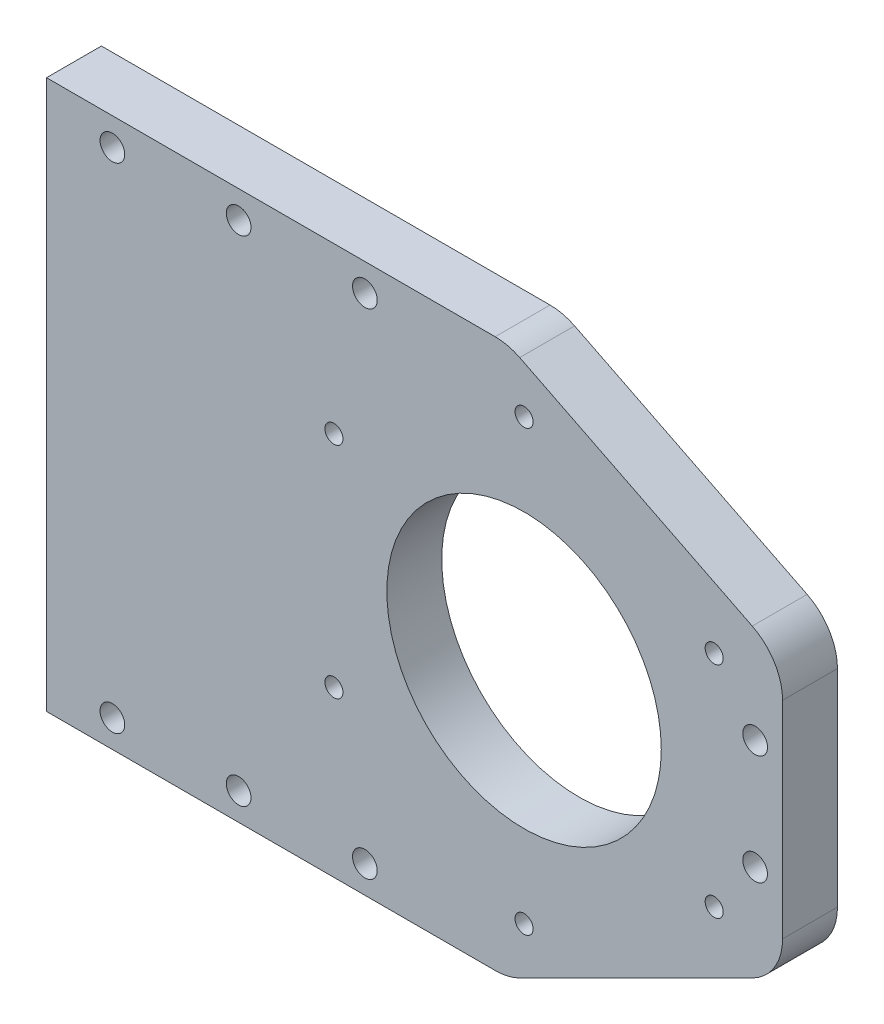
ISO-10303-21;
HEADER;
FILE_DESCRIPTION(('STEP AP214'),'2;1');
FILE_NAME('part.step','',(''),(''),'','','');
FILE_SCHEMA(('AUTOMOTIVE_DESIGN { 1 0 10303 214 1 1 1 1 }'));
ENDSEC;
DATA;
#1=APPLICATION_CONTEXT('core data for automotive mechanical design processes');
#2=APPLICATION_PROTOCOL_DEFINITION('international standard','automotive_design',2000,#1);
#3=PRODUCT_CONTEXT('',#1,'mechanical');
#4=PRODUCT('Part','Part','',(#3));
#5=PRODUCT_RELATED_PRODUCT_CATEGORY('part','',(#4));
#6=PRODUCT_DEFINITION_FORMATION('','',#4);
#7=PRODUCT_DEFINITION_CONTEXT('part definition',#1,'design');
#8=PRODUCT_DEFINITION('design','',#6,#7);
#9=PRODUCT_DEFINITION_SHAPE('','',#8);
#10=(LENGTH_UNIT() NAMED_UNIT(*) SI_UNIT(.MILLI.,.METRE.));
#11=(NAMED_UNIT(*) PLANE_ANGLE_UNIT() SI_UNIT($,.RADIAN.));
#12=(NAMED_UNIT(*) SI_UNIT($,.STERADIAN.) SOLID_ANGLE_UNIT());
#13=UNCERTAINTY_MEASURE_WITH_UNIT(LENGTH_MEASURE(1.E-05),#10,'distance_accuracy_value','');
#14=(GEOMETRIC_REPRESENTATION_CONTEXT(3) GLOBAL_UNCERTAINTY_ASSIGNED_CONTEXT((#13)) GLOBAL_UNIT_ASSIGNED_CONTEXT((#10,
#11,#12)) REPRESENTATION_CONTEXT('',''));
#15=CARTESIAN_POINT('',(0.,0.,0.));
#16=DIRECTION('',(0.,0.,1.));
#17=DIRECTION('',(1.,0.,0.));
#18=AXIS2_PLACEMENT_3D('',#15,#16,#17);
#19=CARTESIAN_POINT('',(0.,50.,10.));
#20=DIRECTION('',(0.,-1.,0.));
#21=DIRECTION('',(0.,0.,-1.));
#22=AXIS2_PLACEMENT_3D('',#19,#20,#21);
#23=PLANE('',#22);
#24=DIRECTION('',(-1.,0.,0.));
#25=VECTOR('',#24,1.);
#26=CARTESIAN_POINT('',(0.,50.,10.));
#27=LINE('',#26,#25);
#28=CARTESIAN_POINT('',(81.7393202250021,50.,10.));
#29=VERTEX_POINT('',#28);
#30=CARTESIAN_POINT('',(0.,50.,10.));
#31=VERTEX_POINT('',#30);
#32=EDGE_CURVE('E109',#29,#31,#27,.T.);
#33=ORIENTED_EDGE('',*,*,#32,.F.);
#34=DIRECTION('',(0.,0.,-1.));
#35=VECTOR('',#34,1.);
#36=CARTESIAN_POINT('',(81.7393202250021,50.,10.));
#37=LINE('',#36,#35);
#38=CARTESIAN_POINT('',(81.7393202250021,50.,0.));
#39=VERTEX_POINT('',#38);
#40=EDGE_CURVE('E11',#29,#39,#37,.T.);
#41=ORIENTED_EDGE('',*,*,#40,.T.);
#42=DIRECTION('',(-1.,0.,0.));
#43=VECTOR('',#42,1.);
#44=CARTESIAN_POINT('',(0.,50.,0.));
#45=LINE('',#44,#43);
#46=CARTESIAN_POINT('',(0.,50.,0.));
#47=VERTEX_POINT('',#46);
#48=EDGE_CURVE('E132',#39,#47,#45,.T.);
#49=ORIENTED_EDGE('',*,*,#48,.T.);
#50=DIRECTION('',(0.,0.,-1.));
#51=VECTOR('',#50,1.);
#52=CARTESIAN_POINT('',(0.,50.,10.));
#53=LINE('',#52,#51);
#54=EDGE_CURVE('E125',#31,#47,#53,.T.);
#55=ORIENTED_EDGE('',*,*,#54,.F.);
#56=EDGE_LOOP('',(#33,#41,#49,#55));
#57=FACE_BOUND('',#56,.T.);
#58=ADVANCED_FACE('F32',(#57),#23,.F.);
#59=CARTESIAN_POINT('',(0.,-50.,10.));
#60=DIRECTION('',(1.,0.,0.));
#61=DIRECTION('',(0.,0.,-1.));
#62=AXIS2_PLACEMENT_3D('',#59,#60,#61);
#63=PLANE('',#62);
#64=CARTESIAN_POINT('',(0.,-12.5,5.00000000000001));
#65=DIRECTION('',(-1.,0.,0.));
#66=DIRECTION('',(0.,0.,-1.));
#67=AXIS2_PLACEMENT_3D('',#64,#65,#66);
#68=CIRCLE('',#67,1.65);
#69=CARTESIAN_POINT('',(0.,-12.5,3.35000000000001));
#70=VERTEX_POINT('',#69);
#71=EDGE_CURVE('E219',#70,#70,#68,.T.);
#72=ORIENTED_EDGE('',*,*,#71,.F.);
#73=EDGE_LOOP('',(#72));
#74=FACE_BOUND('',#73,.T.);
#75=CARTESIAN_POINT('',(0.,-37.5,5.));
#76=DIRECTION('',(-1.,0.,0.));
#77=DIRECTION('',(0.,0.,-1.));
#78=AXIS2_PLACEMENT_3D('',#75,#76,#77);
#79=CIRCLE('',#78,1.65);
#80=CARTESIAN_POINT('',(0.,-37.5,3.35));
#81=VERTEX_POINT('',#80);
#82=EDGE_CURVE('E213',#81,#81,#79,.T.);
#83=ORIENTED_EDGE('',*,*,#82,.F.);
#84=EDGE_LOOP('',(#83));
#85=FACE_BOUND('',#84,.T.);
#86=CARTESIAN_POINT('',(0.,12.5,5.00000000000001));
#87=DIRECTION('',(-1.,0.,0.));
#88=DIRECTION('',(0.,0.,1.));
#89=AXIS2_PLACEMENT_3D('',#86,#87,#88);
#90=CIRCLE('',#89,1.65);
#91=CARTESIAN_POINT('',(0.,12.5,6.65));
#92=VERTEX_POINT('',#91);
#93=EDGE_CURVE('E207',#92,#92,#90,.T.);
#94=ORIENTED_EDGE('',*,*,#93,.F.);
#95=EDGE_LOOP('',(#94));
#96=FACE_BOUND('',#95,.T.);
#97=CARTESIAN_POINT('',(0.,37.5,5.));
#98=DIRECTION('',(-1.,0.,0.));
#99=DIRECTION('',(0.,0.,1.));
#100=AXIS2_PLACEMENT_3D('',#97,#98,#99);
#101=CIRCLE('',#100,1.65);
#102=CARTESIAN_POINT('',(0.,37.5,6.65));
#103=VERTEX_POINT('',#102);
#104=EDGE_CURVE('E201',#103,#103,#101,.T.);
#105=ORIENTED_EDGE('',*,*,#104,.F.);
#106=EDGE_LOOP('',(#105));
#107=FACE_BOUND('',#106,.T.);
#108=DIRECTION('',(0.,-1.,0.));
#109=VECTOR('',#108,1.);
#110=CARTESIAN_POINT('',(0.,-50.,0.));
#111=LINE('',#110,#109);
#112=CARTESIAN_POINT('',(0.,-50.,0.));
#113=VERTEX_POINT('',#112);
#114=EDGE_CURVE('E188',#47,#113,#111,.T.);
#115=ORIENTED_EDGE('',*,*,#114,.T.);
#116=DIRECTION('',(0.,0.,-1.));
#117=VECTOR('',#116,1.);
#118=CARTESIAN_POINT('',(0.,-50.,10.));
#119=LINE('',#118,#117);
#120=CARTESIAN_POINT('',(0.,-50.,10.));
#121=VERTEX_POINT('',#120);
#122=EDGE_CURVE('E127',#121,#113,#119,.T.);
#123=ORIENTED_EDGE('',*,*,#122,.F.);
#124=DIRECTION('',(0.,-1.,0.));
#125=VECTOR('',#124,1.);
#126=CARTESIAN_POINT('',(0.,-50.,10.));
#127=LINE('',#126,#125);
#128=EDGE_CURVE('E113',#31,#121,#127,.T.);
#129=ORIENTED_EDGE('',*,*,#128,.F.);
#130=ORIENTED_EDGE('',*,*,#54,.T.);
#131=EDGE_LOOP('',(#115,#123,#129,#130));
#132=FACE_BOUND('',#131,.T.);
#133=ADVANCED_FACE('F124',(#74,#85,#96,#107,#132),#63,.F.);
#134=CARTESIAN_POINT('',(0.,-50.,10.));
#135=DIRECTION('',(0.,1.,0.));
#136=DIRECTION('',(0.,0.,1.));
#137=AXIS2_PLACEMENT_3D('',#134,#135,#136);
#138=PLANE('',#137);
#139=DIRECTION('',(1.,0.,0.));
#140=VECTOR('',#139,1.);
#141=CARTESIAN_POINT('',(0.,-50.,0.));
#142=LINE('',#141,#140);
#143=CARTESIAN_POINT('',(81.7393202250021,-50.,0.));
#144=VERTEX_POINT('',#143);
#145=EDGE_CURVE('E185',#113,#144,#142,.T.);
#146=ORIENTED_EDGE('',*,*,#145,.T.);
#147=DIRECTION('',(0.,0.,-1.));
#148=VECTOR('',#147,1.);
#149=CARTESIAN_POINT('',(81.7393202250021,-50.,10.));
#150=LINE('',#149,#148);
#151=CARTESIAN_POINT('',(81.7393202250021,-50.,10.));
#152=VERTEX_POINT('',#151);
#153=EDGE_CURVE('E156',#144,#152,#150,.F.);
#154=ORIENTED_EDGE('',*,*,#153,.T.);
#155=DIRECTION('',(1.,0.,0.));
#156=VECTOR('',#155,1.);
#157=CARTESIAN_POINT('',(0.,-50.,10.));
#158=LINE('',#157,#156);
#159=EDGE_CURVE('E129',#121,#152,#158,.T.);
#160=ORIENTED_EDGE('',*,*,#159,.F.);
#161=ORIENTED_EDGE('',*,*,#122,.T.);
#162=EDGE_LOOP('',(#146,#154,#160,#161));
#163=FACE_BOUND('',#162,.T.);
#164=ADVANCED_FACE('F383',(#163),#138,.F.);
#165=CARTESIAN_POINT('',(84.1,-50.,10.));
#166=DIRECTION('',(-0.447213595499958,0.894427190999916,0.));
#167=DIRECTION('',(-0.894427190999916,-0.447213595499958,0.));
#168=AXIS2_PLACEMENT_3D('',#165,#166,#167);
#169=PLANE('',#168);
#170=DIRECTION('',(0.894427190999916,0.447213595499958,0.));
#171=VECTOR('',#170,1.);
#172=CARTESIAN_POINT('',(84.1,-50.,10.));
#173=LINE('',#172,#171);
#174=CARTESIAN_POINT('',(86.2114561800017,-48.9442719099992,10.));
#175=VERTEX_POINT('',#174);
#176=CARTESIAN_POINT('',(128.572135955,-27.7639320225002,10.));
#177=VERTEX_POINT('',#176);
#178=EDGE_CURVE('E194',#175,#177,#173,.T.);
#179=ORIENTED_EDGE('',*,*,#178,.F.);
#180=DIRECTION('',(0.,0.,-1.));
#181=VECTOR('',#180,1.);
#182=CARTESIAN_POINT('',(86.2114561800017,-48.9442719099992,10.));
#183=LINE('',#182,#181);
#184=CARTESIAN_POINT('',(86.2114561800017,-48.9442719099992,0.));
#185=VERTEX_POINT('',#184);
#186=EDGE_CURVE('E136',#175,#185,#183,.T.);
#187=ORIENTED_EDGE('',*,*,#186,.T.);
#188=DIRECTION('',(0.894427190999916,0.447213595499958,0.));
#189=VECTOR('',#188,1.);
#190=CARTESIAN_POINT('',(84.1,-50.,0.));
#191=LINE('',#190,#189);
#192=CARTESIAN_POINT('',(128.572135955,-27.7639320225002,0.));
#193=VERTEX_POINT('',#192);
#194=EDGE_CURVE('E180',#185,#193,#191,.T.);
#195=ORIENTED_EDGE('',*,*,#194,.T.);
#196=DIRECTION('',(0.,0.,-1.));
#197=VECTOR('',#196,1.);
#198=CARTESIAN_POINT('',(128.572135955,-27.7639320225002,10.));
#199=LINE('',#198,#197);
#200=EDGE_CURVE('E134',#193,#177,#199,.F.);
#201=ORIENTED_EDGE('',*,*,#200,.T.);
#202=EDGE_LOOP('',(#179,#187,#195,#201));
#203=FACE_BOUND('',#202,.T.);
#204=ADVANCED_FACE('F412',(#203),#169,.F.);
#205=CARTESIAN_POINT('',(134.1,-25.,10.));
#206=DIRECTION('',(-1.,0.,0.));
#207=DIRECTION('',(0.,0.,1.));
#208=AXIS2_PLACEMENT_3D('',#205,#206,#207);
#209=PLANE('',#208);
#210=DIRECTION('',(0.,1.,0.));
#211=VECTOR('',#210,1.);
#212=CARTESIAN_POINT('',(134.1,-25.,10.));
#213=LINE('',#212,#211);
#214=CARTESIAN_POINT('',(134.1,-18.819660112501,10.));
#215=VERTEX_POINT('',#214);
#216=CARTESIAN_POINT('',(134.1,18.819660112501,10.));
#217=VERTEX_POINT('',#216);
#218=EDGE_CURVE('E192',#215,#217,#213,.T.);
#219=ORIENTED_EDGE('',*,*,#218,.F.);
#220=DIRECTION('',(0.,0.,-1.));
#221=VECTOR('',#220,1.);
#222=CARTESIAN_POINT('',(134.1,-18.819660112501,10.));
#223=LINE('',#222,#221);
#224=CARTESIAN_POINT('',(134.1,-18.819660112501,0.));
#225=VERTEX_POINT('',#224);
#226=EDGE_CURVE('E166',#215,#225,#223,.T.);
#227=ORIENTED_EDGE('',*,*,#226,.T.);
#228=DIRECTION('',(0.,1.,0.));
#229=VECTOR('',#228,1.);
#230=CARTESIAN_POINT('',(134.1,-25.,0.));
#231=LINE('',#230,#229);
#232=CARTESIAN_POINT('',(134.1,18.819660112501,0.));
#233=VERTEX_POINT('',#232);
#234=EDGE_CURVE('E179',#225,#233,#231,.T.);
#235=ORIENTED_EDGE('',*,*,#234,.T.);
#236=DIRECTION('',(0.,0.,-1.));
#237=VECTOR('',#236,1.);
#238=CARTESIAN_POINT('',(134.1,18.819660112501,10.));
#239=LINE('',#238,#237);
#240=EDGE_CURVE('E164',#233,#217,#239,.F.);
#241=ORIENTED_EDGE('',*,*,#240,.T.);
#242=EDGE_LOOP('',(#219,#227,#235,#241));
#243=FACE_BOUND('',#242,.T.);
#244=ADVANCED_FACE('F406',(#243),#209,.F.);
#245=CARTESIAN_POINT('',(84.1,50.,10.));
#246=DIRECTION('',(-0.447213595499958,-0.894427190999916,0.));
#247=DIRECTION('',(0.894427190999916,-0.447213595499958,0.));
#248=AXIS2_PLACEMENT_3D('',#245,#246,#247);
#249=PLANE('',#248);
#250=DIRECTION('',(-0.894427190999916,0.447213595499958,0.));
#251=VECTOR('',#250,1.);
#252=CARTESIAN_POINT('',(84.1,50.,10.));
#253=LINE('',#252,#251);
#254=CARTESIAN_POINT('',(128.572135955,27.7639320225002,10.));
#255=VERTEX_POINT('',#254);
#256=CARTESIAN_POINT('',(86.2114561800017,48.9442719099992,10.));
#257=VERTEX_POINT('',#256);
#258=EDGE_CURVE('E138',#255,#257,#253,.T.);
#259=ORIENTED_EDGE('',*,*,#258,.F.);
#260=DIRECTION('',(0.,0.,-1.));
#261=VECTOR('',#260,1.);
#262=CARTESIAN_POINT('',(128.572135955,27.7639320225002,10.));
#263=LINE('',#262,#261);
#264=CARTESIAN_POINT('',(128.572135955,27.7639320225002,0.));
#265=VERTEX_POINT('',#264);
#266=EDGE_CURVE('E40',#255,#265,#263,.T.);
#267=ORIENTED_EDGE('',*,*,#266,.T.);
#268=DIRECTION('',(-0.894427190999916,0.447213595499958,0.));
#269=VECTOR('',#268,1.);
#270=CARTESIAN_POINT('',(84.1,50.,0.));
#271=LINE('',#270,#269);
#272=CARTESIAN_POINT('',(86.2114561800017,48.9442719099992,0.));
#273=VERTEX_POINT('',#272);
#274=EDGE_CURVE('E120',#265,#273,#271,.T.);
#275=ORIENTED_EDGE('',*,*,#274,.T.);
#276=DIRECTION('',(0.,0.,-1.));
#277=VECTOR('',#276,1.);
#278=CARTESIAN_POINT('',(86.2114561800017,48.9442719099992,10.));
#279=LINE('',#278,#277);
#280=EDGE_CURVE('E47',#273,#257,#279,.F.);
#281=ORIENTED_EDGE('',*,*,#280,.T.);
#282=EDGE_LOOP('',(#259,#267,#275,#281));
#283=FACE_BOUND('',#282,.T.);
#284=ADVANCED_FACE('F172',(#283),#249,.F.);
#285=CARTESIAN_POINT('',(134.1,50.,10.));
#286=DIRECTION('',(0.,0.,1.));
#287=DIRECTION('',(1.,0.,0.));
#288=AXIS2_PLACEMENT_3D('',#285,#286,#287);
#289=PLANE('',#288);
#290=CARTESIAN_POINT('',(129.1,-10.,10.));
#291=DIRECTION('',(0.,0.,-1.));
#292=DIRECTION('',(1.,0.,0.));
#293=AXIS2_PLACEMENT_3D('',#290,#291,#292);
#294=CIRCLE('',#293,2.25000000000001);
#295=CARTESIAN_POINT('',(131.35,-10.,10.));
#296=VERTEX_POINT('',#295);
#297=EDGE_CURVE('E317',#296,#296,#294,.T.);
#298=ORIENTED_EDGE('',*,*,#297,.T.);
#299=EDGE_LOOP('',(#298));
#300=FACE_BOUND('',#299,.T.);
#301=CARTESIAN_POINT('',(129.1,10.,10.));
#302=DIRECTION('',(0.,0.,-1.));
#303=DIRECTION('',(-1.,0.,0.));
#304=AXIS2_PLACEMENT_3D('',#301,#302,#303);
#305=CIRCLE('',#304,2.25000000000001);
#306=CARTESIAN_POINT('',(126.85,10.,10.));
#307=VERTEX_POINT('',#306);
#308=EDGE_CURVE('E312',#307,#307,#305,.T.);
#309=ORIENTED_EDGE('',*,*,#308,.T.);
#310=EDGE_LOOP('',(#309));
#311=FACE_BOUND('',#310,.T.);
#312=CARTESIAN_POINT('',(121.641016151378,20.,10.));
#313=DIRECTION('',(0.,0.,-1.));
#314=DIRECTION('',(-1.,0.,0.));
#315=AXIS2_PLACEMENT_3D('',#312,#313,#314);
#316=CIRCLE('',#315,1.65);
#317=CARTESIAN_POINT('',(119.991016151378,20.,10.));
#318=VERTEX_POINT('',#317);
#319=EDGE_CURVE('E306',#318,#318,#316,.T.);
#320=ORIENTED_EDGE('',*,*,#319,.T.);
#321=EDGE_LOOP('',(#320));
#322=FACE_BOUND('',#321,.T.);
#323=CARTESIAN_POINT('',(121.641016151378,-20.,10.));
#324=DIRECTION('',(0.,0.,-1.));
#325=DIRECTION('',(-1.,0.,0.));
#326=AXIS2_PLACEMENT_3D('',#323,#324,#325);
#327=CIRCLE('',#326,1.65);
#328=CARTESIAN_POINT('',(119.991016151378,-20.,10.));
#329=VERTEX_POINT('',#328);
#330=EDGE_CURVE('E300',#329,#329,#327,.T.);
#331=ORIENTED_EDGE('',*,*,#330,.T.);
#332=EDGE_LOOP('',(#331));
#333=FACE_BOUND('',#332,.T.);
#334=CARTESIAN_POINT('',(87.,-40.,10.));
#335=DIRECTION('',(0.,0.,-1.));
#336=DIRECTION('',(-1.,0.,0.));
#337=AXIS2_PLACEMENT_3D('',#334,#335,#336);
#338=CIRCLE('',#337,1.65);
#339=CARTESIAN_POINT('',(85.35,-40.,10.));
#340=VERTEX_POINT('',#339);
#341=EDGE_CURVE('E294',#340,#340,#338,.T.);
#342=ORIENTED_EDGE('',*,*,#341,.T.);
#343=EDGE_LOOP('',(#342));
#344=FACE_BOUND('',#343,.T.);
#345=CARTESIAN_POINT('',(52.3589838486224,-20.,10.));
#346=DIRECTION('',(0.,0.,-1.));
#347=DIRECTION('',(-1.,0.,0.));
#348=AXIS2_PLACEMENT_3D('',#345,#346,#347);
#349=CIRCLE('',#348,1.65);
#350=CARTESIAN_POINT('',(50.7089838486225,-20.,10.));
#351=VERTEX_POINT('',#350);
#352=EDGE_CURVE('E288',#351,#351,#349,.T.);
#353=ORIENTED_EDGE('',*,*,#352,.T.);
#354=EDGE_LOOP('',(#353));
#355=FACE_BOUND('',#354,.T.);
#356=CARTESIAN_POINT('',(52.3589838486224,20.,10.));
#357=DIRECTION('',(0.,0.,-1.));
#358=DIRECTION('',(-1.,0.,0.));
#359=AXIS2_PLACEMENT_3D('',#356,#357,#358);
#360=CIRCLE('',#359,1.65);
#361=CARTESIAN_POINT('',(50.7089838486224,20.,10.));
#362=VERTEX_POINT('',#361);
#363=EDGE_CURVE('E282',#362,#362,#360,.T.);
#364=ORIENTED_EDGE('',*,*,#363,.T.);
#365=EDGE_LOOP('',(#364));
#366=FACE_BOUND('',#365,.T.);
#367=CARTESIAN_POINT('',(87.,40.,10.));
#368=DIRECTION('',(0.,0.,-1.));
#369=DIRECTION('',(-1.,0.,0.));
#370=AXIS2_PLACEMENT_3D('',#367,#368,#369);
#371=CIRCLE('',#370,1.65);
#372=CARTESIAN_POINT('',(85.35,40.,10.));
#373=VERTEX_POINT('',#372);
#374=EDGE_CURVE('E278',#373,#373,#371,.T.);
#375=ORIENTED_EDGE('',*,*,#374,.T.);
#376=EDGE_LOOP('',(#375));
#377=FACE_BOUND('',#376,.T.);
#378=CARTESIAN_POINT('',(12.,45.,10.));
#379=DIRECTION('',(0.,0.,-1.));
#380=DIRECTION('',(-1.,0.,0.));
#381=AXIS2_PLACEMENT_3D('',#378,#379,#380);
#382=CIRCLE('',#381,2.25);
#383=CARTESIAN_POINT('',(9.75000000000001,45.,10.));
#384=VERTEX_POINT('',#383);
#385=EDGE_CURVE('E269',#384,#384,#382,.T.);
#386=ORIENTED_EDGE('',*,*,#385,.T.);
#387=EDGE_LOOP('',(#386));
#388=FACE_BOUND('',#387,.T.);
#389=CARTESIAN_POINT('',(35.,45.,10.));
#390=DIRECTION('',(0.,0.,-1.));
#391=DIRECTION('',(-1.,0.,0.));
#392=AXIS2_PLACEMENT_3D('',#389,#390,#391);
#393=CIRCLE('',#392,2.25);
#394=CARTESIAN_POINT('',(32.75,45.,10.));
#395=VERTEX_POINT('',#394);
#396=EDGE_CURVE('E260',#395,#395,#393,.T.);
#397=ORIENTED_EDGE('',*,*,#396,.T.);
#398=EDGE_LOOP('',(#397));
#399=FACE_BOUND('',#398,.T.);
#400=CARTESIAN_POINT('',(58.,45.,10.));
#401=DIRECTION('',(0.,0.,-1.));
#402=DIRECTION('',(-1.,0.,0.));
#403=AXIS2_PLACEMENT_3D('',#400,#401,#402);
#404=CIRCLE('',#403,2.25);
#405=CARTESIAN_POINT('',(55.75,45.,10.));
#406=VERTEX_POINT('',#405);
#407=EDGE_CURVE('E251',#406,#406,#404,.T.);
#408=ORIENTED_EDGE('',*,*,#407,.T.);
#409=EDGE_LOOP('',(#408));
#410=FACE_BOUND('',#409,.T.);
#411=CARTESIAN_POINT('',(12.,-45.,10.));
#412=DIRECTION('',(0.,0.,-1.));
#413=DIRECTION('',(-1.,0.,0.));
#414=AXIS2_PLACEMENT_3D('',#411,#412,#413);
#415=CIRCLE('',#414,2.25);
#416=CARTESIAN_POINT('',(9.74999999999996,-45.,10.));
#417=VERTEX_POINT('',#416);
#418=EDGE_CURVE('E242',#417,#417,#415,.T.);
#419=ORIENTED_EDGE('',*,*,#418,.T.);
#420=EDGE_LOOP('',(#419));
#421=FACE_BOUND('',#420,.T.);
#422=CARTESIAN_POINT('',(35.,-45.,10.));
#423=DIRECTION('',(0.,0.,-1.));
#424=DIRECTION('',(-1.,0.,0.));
#425=AXIS2_PLACEMENT_3D('',#422,#423,#424);
#426=CIRCLE('',#425,2.25);
#427=CARTESIAN_POINT('',(32.75,-45.,10.));
#428=VERTEX_POINT('',#427);
#429=EDGE_CURVE('E233',#428,#428,#426,.T.);
#430=ORIENTED_EDGE('',*,*,#429,.T.);
#431=EDGE_LOOP('',(#430));
#432=FACE_BOUND('',#431,.T.);
#433=CARTESIAN_POINT('',(58.,-45.,10.));
#434=DIRECTION('',(0.,0.,-1.));
#435=DIRECTION('',(-1.,0.,0.));
#436=AXIS2_PLACEMENT_3D('',#433,#434,#435);
#437=CIRCLE('',#436,2.25);
#438=CARTESIAN_POINT('',(55.75,-45.,10.));
#439=VERTEX_POINT('',#438);
#440=EDGE_CURVE('E222',#439,#439,#437,.T.);
#441=ORIENTED_EDGE('',*,*,#440,.T.);
#442=EDGE_LOOP('',(#441));
#443=FACE_BOUND('',#442,.T.);
#444=CARTESIAN_POINT('',(87.,0.,10.));
#445=DIRECTION('',(0.,0.,1.));
#446=DIRECTION('',(1.,0.,0.));
#447=AXIS2_PLACEMENT_3D('',#444,#445,#446);
#448=CIRCLE('',#447,25.);
#449=CARTESIAN_POINT('',(112.,0.,10.));
#450=VERTEX_POINT('',#449);
#451=EDGE_CURVE('E144',#450,#450,#448,.T.);
#452=ORIENTED_EDGE('',*,*,#451,.F.);
#453=EDGE_LOOP('',(#452));
#454=FACE_BOUND('',#453,.T.);
#455=ORIENTED_EDGE('',*,*,#159,.T.);
#456=CARTESIAN_POINT('',(81.7393202250021,-40.,10.));
#457=DIRECTION('',(0.,0.,1.));
#458=DIRECTION('',(1.,0.,0.));
#459=AXIS2_PLACEMENT_3D('',#456,#457,#458);
#460=CIRCLE('',#459,10.);
#461=EDGE_CURVE('E162',#152,#175,#460,.T.);
#462=ORIENTED_EDGE('',*,*,#461,.T.);
#463=ORIENTED_EDGE('',*,*,#178,.T.);
#464=CARTESIAN_POINT('',(124.1,-18.819660112501,10.));
#465=DIRECTION('',(0.,0.,1.));
#466=DIRECTION('',(1.,0.,0.));
#467=AXIS2_PLACEMENT_3D('',#464,#465,#466);
#468=CIRCLE('',#467,10.);
#469=EDGE_CURVE('E160',#177,#215,#468,.T.);
#470=ORIENTED_EDGE('',*,*,#469,.T.);
#471=ORIENTED_EDGE('',*,*,#218,.T.);
#472=CARTESIAN_POINT('',(124.1,18.819660112501,10.));
#473=DIRECTION('',(0.,0.,1.));
#474=DIRECTION('',(1.,0.,0.));
#475=AXIS2_PLACEMENT_3D('',#472,#473,#474);
#476=CIRCLE('',#475,10.);
#477=EDGE_CURVE('E54',#217,#255,#476,.T.);
#478=ORIENTED_EDGE('',*,*,#477,.T.);
#479=ORIENTED_EDGE('',*,*,#258,.T.);
#480=CARTESIAN_POINT('',(81.7393202250021,40.,10.));
#481=DIRECTION('',(0.,0.,1.));
#482=DIRECTION('',(1.,0.,0.));
#483=AXIS2_PLACEMENT_3D('',#480,#481,#482);
#484=CIRCLE('',#483,10.);
#485=EDGE_CURVE('E116',#257,#29,#484,.T.);
#486=ORIENTED_EDGE('',*,*,#485,.T.);
#487=ORIENTED_EDGE('',*,*,#32,.T.);
#488=ORIENTED_EDGE('',*,*,#128,.T.);
#489=EDGE_LOOP('',(#455,#462,#463,#470,#471,#478,#479,#486,#487,#488));
#490=FACE_BOUND('',#489,.T.);
#491=ADVANCED_FACE('F112',(#300,#311,#322,#333,#344,#355,#366,#377,#388,#399,#410,#421,#432,
#443,#454,#490),#289,.T.);
#492=CARTESIAN_POINT('',(134.1,50.,0.));
#493=DIRECTION('',(0.,0.,1.));
#494=DIRECTION('',(1.,0.,0.));
#495=AXIS2_PLACEMENT_3D('',#492,#493,#494);
#496=PLANE('',#495);
#497=CARTESIAN_POINT('',(129.1,10.,0.));
#498=DIRECTION('',(0.,0.,-1.));
#499=DIRECTION('',(-1.,0.,0.));
#500=AXIS2_PLACEMENT_3D('',#497,#498,#499);
#501=CIRCLE('',#500,4.70000000000001);
#502=CARTESIAN_POINT('',(124.4,10.,0.));
#503=VERTEX_POINT('',#502);
#504=EDGE_CURVE('E329',#503,#503,#501,.T.);
#505=ORIENTED_EDGE('',*,*,#504,.F.);
#506=EDGE_LOOP('',(#505));
#507=FACE_BOUND('',#506,.T.);
#508=CARTESIAN_POINT('',(129.1,-10.,0.));
#509=DIRECTION('',(0.,0.,-1.));
#510=DIRECTION('',(-1.,0.,0.));
#511=AXIS2_PLACEMENT_3D('',#508,#509,#510);
#512=CIRCLE('',#511,4.70000000000001);
#513=CARTESIAN_POINT('',(124.4,-10.,0.));
#514=VERTEX_POINT('',#513);
#515=EDGE_CURVE('E323',#514,#514,#512,.T.);
#516=ORIENTED_EDGE('',*,*,#515,.F.);
#517=EDGE_LOOP('',(#516));
#518=FACE_BOUND('',#517,.T.);
#519=CARTESIAN_POINT('',(121.641016151378,20.,0.));
#520=DIRECTION('',(0.,0.,-1.));
#521=DIRECTION('',(-1.,0.,0.));
#522=AXIS2_PLACEMENT_3D('',#519,#520,#521);
#523=CIRCLE('',#522,1.65);
#524=CARTESIAN_POINT('',(119.991016151378,20.,0.));
#525=VERTEX_POINT('',#524);
#526=EDGE_CURVE('E309',#525,#525,#523,.T.);
#527=ORIENTED_EDGE('',*,*,#526,.F.);
#528=EDGE_LOOP('',(#527));
#529=FACE_BOUND('',#528,.T.);
#530=CARTESIAN_POINT('',(121.641016151378,-20.,0.));
#531=DIRECTION('',(0.,0.,-1.));
#532=DIRECTION('',(-1.,0.,0.));
#533=AXIS2_PLACEMENT_3D('',#530,#531,#532);
#534=CIRCLE('',#533,1.65);
#535=CARTESIAN_POINT('',(119.991016151378,-20.,0.));
#536=VERTEX_POINT('',#535);
#537=EDGE_CURVE('E303',#536,#536,#534,.T.);
#538=ORIENTED_EDGE('',*,*,#537,.F.);
#539=EDGE_LOOP('',(#538));
#540=FACE_BOUND('',#539,.T.);
#541=CARTESIAN_POINT('',(87.,-40.,0.));
#542=DIRECTION('',(0.,0.,-1.));
#543=DIRECTION('',(-1.,0.,0.));
#544=AXIS2_PLACEMENT_3D('',#541,#542,#543);
#545=CIRCLE('',#544,1.65);
#546=CARTESIAN_POINT('',(85.35,-40.,0.));
#547=VERTEX_POINT('',#546);
#548=EDGE_CURVE('E297',#547,#547,#545,.T.);
#549=ORIENTED_EDGE('',*,*,#548,.F.);
#550=EDGE_LOOP('',(#549));
#551=FACE_BOUND('',#550,.T.);
#552=CARTESIAN_POINT('',(52.3589838486224,-20.,0.));
#553=DIRECTION('',(0.,0.,-1.));
#554=DIRECTION('',(-1.,0.,0.));
#555=AXIS2_PLACEMENT_3D('',#552,#553,#554);
#556=CIRCLE('',#555,1.65);
#557=CARTESIAN_POINT('',(50.7089838486225,-20.,0.));
#558=VERTEX_POINT('',#557);
#559=EDGE_CURVE('E291',#558,#558,#556,.T.);
#560=ORIENTED_EDGE('',*,*,#559,.F.);
#561=EDGE_LOOP('',(#560));
#562=FACE_BOUND('',#561,.T.);
#563=CARTESIAN_POINT('',(52.3589838486224,20.,0.));
#564=DIRECTION('',(0.,0.,-1.));
#565=DIRECTION('',(-1.,0.,0.));
#566=AXIS2_PLACEMENT_3D('',#563,#564,#565);
#567=CIRCLE('',#566,1.65);
#568=CARTESIAN_POINT('',(50.7089838486224,20.,0.));
#569=VERTEX_POINT('',#568);
#570=EDGE_CURVE('E285',#569,#569,#567,.T.);
#571=ORIENTED_EDGE('',*,*,#570,.F.);
#572=EDGE_LOOP('',(#571));
#573=FACE_BOUND('',#572,.T.);
#574=CARTESIAN_POINT('',(87.,40.,0.));
#575=DIRECTION('',(0.,0.,-1.));
#576=DIRECTION('',(-1.,0.,0.));
#577=AXIS2_PLACEMENT_3D('',#574,#575,#576);
#578=CIRCLE('',#577,1.65);
#579=CARTESIAN_POINT('',(85.35,40.,0.));
#580=VERTEX_POINT('',#579);
#581=EDGE_CURVE('E279',#580,#580,#578,.T.);
#582=ORIENTED_EDGE('',*,*,#581,.F.);
#583=EDGE_LOOP('',(#582));
#584=FACE_BOUND('',#583,.T.);
#585=CARTESIAN_POINT('',(12.,45.,0.));
#586=DIRECTION('',(0.,0.,-1.));
#587=DIRECTION('',(-1.,0.,0.));
#588=AXIS2_PLACEMENT_3D('',#585,#586,#587);
#589=CIRCLE('',#588,4.7);
#590=CARTESIAN_POINT('',(7.3,45.,0.));
#591=VERTEX_POINT('',#590);
#592=EDGE_CURVE('E275',#591,#591,#589,.T.);
#593=ORIENTED_EDGE('',*,*,#592,.F.);
#594=EDGE_LOOP('',(#593));
#595=FACE_BOUND('',#594,.T.);
#596=CARTESIAN_POINT('',(35.,45.,0.));
#597=DIRECTION('',(0.,0.,-1.));
#598=DIRECTION('',(-1.,0.,0.));
#599=AXIS2_PLACEMENT_3D('',#596,#597,#598);
#600=CIRCLE('',#599,4.7);
#601=CARTESIAN_POINT('',(30.3,45.,0.));
#602=VERTEX_POINT('',#601);
#603=EDGE_CURVE('E266',#602,#602,#600,.T.);
#604=ORIENTED_EDGE('',*,*,#603,.F.);
#605=EDGE_LOOP('',(#604));
#606=FACE_BOUND('',#605,.T.);
#607=CARTESIAN_POINT('',(58.,45.,0.));
#608=DIRECTION('',(0.,0.,-1.));
#609=DIRECTION('',(-1.,0.,0.));
#610=AXIS2_PLACEMENT_3D('',#607,#608,#609);
#611=CIRCLE('',#610,4.7);
#612=CARTESIAN_POINT('',(53.3,45.,0.));
#613=VERTEX_POINT('',#612);
#614=EDGE_CURVE('E257',#613,#613,#611,.T.);
#615=ORIENTED_EDGE('',*,*,#614,.F.);
#616=EDGE_LOOP('',(#615));
#617=FACE_BOUND('',#616,.T.);
#618=CARTESIAN_POINT('',(12.,-45.,0.));
#619=DIRECTION('',(0.,0.,-1.));
#620=DIRECTION('',(-1.,0.,0.));
#621=AXIS2_PLACEMENT_3D('',#618,#619,#620);
#622=CIRCLE('',#621,4.7);
#623=CARTESIAN_POINT('',(7.29999999999996,-45.,0.));
#624=VERTEX_POINT('',#623);
#625=EDGE_CURVE('E248',#624,#624,#622,.T.);
#626=ORIENTED_EDGE('',*,*,#625,.F.);
#627=EDGE_LOOP('',(#626));
#628=FACE_BOUND('',#627,.T.);
#629=CARTESIAN_POINT('',(35.,-45.,0.));
#630=DIRECTION('',(0.,0.,-1.));
#631=DIRECTION('',(-1.,0.,0.));
#632=AXIS2_PLACEMENT_3D('',#629,#630,#631);
#633=CIRCLE('',#632,4.7);
#634=CARTESIAN_POINT('',(30.3,-45.,0.));
#635=VERTEX_POINT('',#634);
#636=EDGE_CURVE('E239',#635,#635,#633,.T.);
#637=ORIENTED_EDGE('',*,*,#636,.F.);
#638=EDGE_LOOP('',(#637));
#639=FACE_BOUND('',#638,.T.);
#640=CARTESIAN_POINT('',(58.,-45.,0.));
#641=DIRECTION('',(0.,0.,-1.));
#642=DIRECTION('',(-1.,0.,0.));
#643=AXIS2_PLACEMENT_3D('',#640,#641,#642);
#644=CIRCLE('',#643,4.7);
#645=CARTESIAN_POINT('',(53.3,-45.,0.));
#646=VERTEX_POINT('',#645);
#647=EDGE_CURVE('E230',#646,#646,#644,.T.);
#648=ORIENTED_EDGE('',*,*,#647,.F.);
#649=EDGE_LOOP('',(#648));
#650=FACE_BOUND('',#649,.T.);
#651=CARTESIAN_POINT('',(87.,0.,0.));
#652=DIRECTION('',(0.,0.,1.));
#653=DIRECTION('',(1.,0.,0.));
#654=AXIS2_PLACEMENT_3D('',#651,#652,#653);
#655=CIRCLE('',#654,25.);
#656=CARTESIAN_POINT('',(112.,0.,0.));
#657=VERTEX_POINT('',#656);
#658=EDGE_CURVE('E142',#657,#657,#655,.T.);
#659=ORIENTED_EDGE('',*,*,#658,.T.);
#660=EDGE_LOOP('',(#659));
#661=FACE_BOUND('',#660,.T.);
#662=ORIENTED_EDGE('',*,*,#194,.F.);
#663=CARTESIAN_POINT('',(81.7393202250021,-40.,0.));
#664=DIRECTION('',(0.,0.,1.));
#665=DIRECTION('',(1.,0.,0.));
#666=AXIS2_PLACEMENT_3D('',#663,#664,#665);
#667=CIRCLE('',#666,10.);
#668=EDGE_CURVE('E154',#185,#144,#667,.F.);
#669=ORIENTED_EDGE('',*,*,#668,.T.);
#670=ORIENTED_EDGE('',*,*,#145,.F.);
#671=ORIENTED_EDGE('',*,*,#114,.F.);
#672=ORIENTED_EDGE('',*,*,#48,.F.);
#673=CARTESIAN_POINT('',(81.7393202250021,40.,0.));
#674=DIRECTION('',(0.,0.,1.));
#675=DIRECTION('',(1.,0.,0.));
#676=AXIS2_PLACEMENT_3D('',#673,#674,#675);
#677=CIRCLE('',#676,10.);
#678=EDGE_CURVE('E148',#39,#273,#677,.F.);
#679=ORIENTED_EDGE('',*,*,#678,.T.);
#680=ORIENTED_EDGE('',*,*,#274,.F.);
#681=CARTESIAN_POINT('',(124.1,18.819660112501,0.));
#682=DIRECTION('',(0.,0.,1.));
#683=DIRECTION('',(1.,0.,0.));
#684=AXIS2_PLACEMENT_3D('',#681,#682,#683);
#685=CIRCLE('',#684,10.);
#686=EDGE_CURVE('E150',#265,#233,#685,.F.);
#687=ORIENTED_EDGE('',*,*,#686,.T.);
#688=ORIENTED_EDGE('',*,*,#234,.F.);
#689=CARTESIAN_POINT('',(124.1,-18.819660112501,0.));
#690=DIRECTION('',(0.,0.,1.));
#691=DIRECTION('',(1.,0.,0.));
#692=AXIS2_PLACEMENT_3D('',#689,#690,#691);
#693=CIRCLE('',#692,10.);
#694=EDGE_CURVE('E152',#225,#193,#693,.F.);
#695=ORIENTED_EDGE('',*,*,#694,.T.);
#696=EDGE_LOOP('',(#662,#669,#670,#671,#672,#679,#680,#687,#688,#695));
#697=FACE_BOUND('',#696,.T.);
#698=ADVANCED_FACE('F176',(#507,#518,#529,#540,#551,#562,#573,#584,#595,#606,#617,#628,#639,
#650,#661,#697),#496,.F.);
#699=CARTESIAN_POINT('',(87.,0.,-10.));
#700=DIRECTION('',(0.,0.,1.));
#701=DIRECTION('',(1.,0.,0.));
#702=AXIS2_PLACEMENT_3D('',#699,#700,#701);
#703=CYLINDRICAL_SURFACE('',#702,25.);
#704=ORIENTED_EDGE('',*,*,#451,.T.);
#705=EDGE_LOOP('',(#704));
#706=FACE_BOUND('',#705,.T.);
#707=ORIENTED_EDGE('',*,*,#658,.F.);
#708=EDGE_LOOP('',(#707));
#709=FACE_BOUND('',#708,.T.);
#710=ADVANCED_FACE('F337',(#706,#709),#703,.F.);
#711=CARTESIAN_POINT('',(15.,37.5,5.));
#712=DIRECTION('',(-1.,0.,0.));
#713=DIRECTION('',(0.,0.,1.));
#714=AXIS2_PLACEMENT_3D('',#711,#712,#713);
#715=CYLINDRICAL_SURFACE('',#714,1.65);
#716=CARTESIAN_POINT('',(15.,37.5,5.));
#717=DIRECTION('',(-1.,0.,0.));
#718=DIRECTION('',(0.,0.,1.));
#719=AXIS2_PLACEMENT_3D('',#716,#717,#718);
#720=CIRCLE('',#719,1.65);
#721=CARTESIAN_POINT('',(15.,37.5,6.65));
#722=VERTEX_POINT('',#721);
#723=EDGE_CURVE('E200',#722,#722,#720,.T.);
#724=ORIENTED_EDGE('',*,*,#723,.F.);
#725=EDGE_LOOP('',(#724));
#726=FACE_BOUND('',#725,.T.);
#727=ORIENTED_EDGE('',*,*,#104,.T.);
#728=EDGE_LOOP('',(#727));
#729=FACE_BOUND('',#728,.T.);
#730=ADVANCED_FACE('F368',(#726,#729),#715,.F.);
#731=CARTESIAN_POINT('',(15.,37.5,5.));
#732=DIRECTION('',(-1.,0.,0.));
#733=DIRECTION('',(0.,0.,1.));
#734=AXIS2_PLACEMENT_3D('',#731,#732,#733);
#735=PLANE('',#734);
#736=ORIENTED_EDGE('',*,*,#723,.T.);
#737=EDGE_LOOP('',(#736));
#738=FACE_BOUND('',#737,.T.);
#739=ADVANCED_FACE('F374',(#738),#735,.T.);
#740=CARTESIAN_POINT('',(15.,12.5,5.00000000000001));
#741=DIRECTION('',(-1.,0.,0.));
#742=DIRECTION('',(0.,0.,1.));
#743=AXIS2_PLACEMENT_3D('',#740,#741,#742);
#744=CYLINDRICAL_SURFACE('',#743,1.65);
#745=CARTESIAN_POINT('',(15.,12.5,5.00000000000001));
#746=DIRECTION('',(-1.,0.,0.));
#747=DIRECTION('',(0.,0.,1.));
#748=AXIS2_PLACEMENT_3D('',#745,#746,#747);
#749=CIRCLE('',#748,1.65);
#750=CARTESIAN_POINT('',(15.,12.5,6.65));
#751=VERTEX_POINT('',#750);
#752=EDGE_CURVE('E204',#751,#751,#749,.T.);
#753=ORIENTED_EDGE('',*,*,#752,.F.);
#754=EDGE_LOOP('',(#753));
#755=FACE_BOUND('',#754,.T.);
#756=ORIENTED_EDGE('',*,*,#93,.T.);
#757=EDGE_LOOP('',(#756));
#758=FACE_BOUND('',#757,.T.);
#759=ADVANCED_FACE('F499',(#755,#758),#744,.F.);
#760=CARTESIAN_POINT('',(15.,12.5,5.00000000000001));
#761=DIRECTION('',(-1.,0.,0.));
#762=DIRECTION('',(0.,0.,1.));
#763=AXIS2_PLACEMENT_3D('',#760,#761,#762);
#764=PLANE('',#763);
#765=ORIENTED_EDGE('',*,*,#752,.T.);
#766=EDGE_LOOP('',(#765));
#767=FACE_BOUND('',#766,.T.);
#768=ADVANCED_FACE('F495',(#767),#764,.T.);
#769=CARTESIAN_POINT('',(15.,-37.5,5.));
#770=DIRECTION('',(-1.,0.,0.));
#771=DIRECTION('',(0.,0.,1.));
#772=AXIS2_PLACEMENT_3D('',#769,#770,#771);
#773=CYLINDRICAL_SURFACE('',#772,1.65);
#774=CARTESIAN_POINT('',(15.,-37.5,5.));
#775=DIRECTION('',(-1.,0.,0.));
#776=DIRECTION('',(0.,0.,-1.));
#777=AXIS2_PLACEMENT_3D('',#774,#775,#776);
#778=CIRCLE('',#777,1.65);
#779=CARTESIAN_POINT('',(15.,-37.5,3.35));
#780=VERTEX_POINT('',#779);
#781=EDGE_CURVE('E210',#780,#780,#778,.T.);
#782=ORIENTED_EDGE('',*,*,#781,.F.);
#783=EDGE_LOOP('',(#782));
#784=FACE_BOUND('',#783,.T.);
#785=ORIENTED_EDGE('',*,*,#82,.T.);
#786=EDGE_LOOP('',(#785));
#787=FACE_BOUND('',#786,.T.);
#788=ADVANCED_FACE('F491',(#784,#787),#773,.F.);
#789=CARTESIAN_POINT('',(15.,-37.5,5.));
#790=DIRECTION('',(1.,0.,0.));
#791=DIRECTION('',(0.,0.,-1.));
#792=AXIS2_PLACEMENT_3D('',#789,#790,#791);
#793=PLANE('',#792);
#794=ORIENTED_EDGE('',*,*,#781,.T.);
#795=EDGE_LOOP('',(#794));
#796=FACE_BOUND('',#795,.T.);
#797=ADVANCED_FACE('F487',(#796),#793,.F.);
#798=CARTESIAN_POINT('',(15.,-12.5,5.00000000000001));
#799=DIRECTION('',(-1.,0.,0.));
#800=DIRECTION('',(0.,0.,1.));
#801=AXIS2_PLACEMENT_3D('',#798,#799,#800);
#802=CYLINDRICAL_SURFACE('',#801,1.65);
#803=CARTESIAN_POINT('',(15.,-12.5,5.00000000000001));
#804=DIRECTION('',(-1.,0.,0.));
#805=DIRECTION('',(0.,0.,-1.));
#806=AXIS2_PLACEMENT_3D('',#803,#804,#805);
#807=CIRCLE('',#806,1.65);
#808=CARTESIAN_POINT('',(15.,-12.5,3.35000000000001));
#809=VERTEX_POINT('',#808);
#810=EDGE_CURVE('E216',#809,#809,#807,.T.);
#811=ORIENTED_EDGE('',*,*,#810,.F.);
#812=EDGE_LOOP('',(#811));
#813=FACE_BOUND('',#812,.T.);
#814=ORIENTED_EDGE('',*,*,#71,.T.);
#815=EDGE_LOOP('',(#814));
#816=FACE_BOUND('',#815,.T.);
#817=ADVANCED_FACE('F483',(#813,#816),#802,.F.);
#818=CARTESIAN_POINT('',(15.,-12.5,5.00000000000001));
#819=DIRECTION('',(1.,0.,0.));
#820=DIRECTION('',(0.,0.,-1.));
#821=AXIS2_PLACEMENT_3D('',#818,#819,#820);
#822=PLANE('',#821);
#823=ORIENTED_EDGE('',*,*,#810,.T.);
#824=EDGE_LOOP('',(#823));
#825=FACE_BOUND('',#824,.T.);
#826=ADVANCED_FACE('F465',(#825),#822,.F.);
#827=CARTESIAN_POINT('',(58.,-45.,0.));
#828=DIRECTION('',(0.,0.,-1.));
#829=DIRECTION('',(-1.,0.,0.));
#830=AXIS2_PLACEMENT_3D('',#827,#828,#829);
#831=CYLINDRICAL_SURFACE('',#830,2.25);
#832=ORIENTED_EDGE('',*,*,#440,.F.);
#833=EDGE_LOOP('',(#832));
#834=FACE_BOUND('',#833,.T.);
#835=CARTESIAN_POINT('',(58.,-45.,2.45));
#836=DIRECTION('',(0.,0.,-1.));
#837=DIRECTION('',(-1.,0.,0.));
#838=AXIS2_PLACEMENT_3D('',#835,#836,#837);
#839=CIRCLE('',#838,2.25);
#840=CARTESIAN_POINT('',(55.75,-45.,2.45));
#841=VERTEX_POINT('',#840);
#842=EDGE_CURVE('E227',#841,#841,#839,.T.);
#843=ORIENTED_EDGE('',*,*,#842,.T.);
#844=EDGE_LOOP('',(#843));
#845=FACE_BOUND('',#844,.T.);
#846=ADVANCED_FACE('F461',(#834,#845),#831,.F.);
#847=CARTESIAN_POINT('',(58.,-45.,0.));
#848=DIRECTION('',(0.,0.,-1.));
#849=DIRECTION('',(-1.,0.,0.));
#850=AXIS2_PLACEMENT_3D('',#847,#848,#849);
#851=CONICAL_SURFACE('',#850,4.7,0.78539816339745);
#852=ORIENTED_EDGE('',*,*,#842,.F.);
#853=EDGE_LOOP('',(#852));
#854=FACE_BOUND('',#853,.T.);
#855=ORIENTED_EDGE('',*,*,#647,.T.);
#856=EDGE_LOOP('',(#855));
#857=FACE_BOUND('',#856,.T.);
#858=ADVANCED_FACE('F464',(#854,#857),#851,.F.);
#859=CARTESIAN_POINT('',(35.,-45.,0.));
#860=DIRECTION('',(0.,0.,-1.));
#861=DIRECTION('',(-1.,0.,0.));
#862=AXIS2_PLACEMENT_3D('',#859,#860,#861);
#863=CYLINDRICAL_SURFACE('',#862,2.25);
#864=ORIENTED_EDGE('',*,*,#429,.F.);
#865=EDGE_LOOP('',(#864));
#866=FACE_BOUND('',#865,.T.);
#867=CARTESIAN_POINT('',(35.,-45.,2.45));
#868=DIRECTION('',(0.,0.,-1.));
#869=DIRECTION('',(-1.,0.,0.));
#870=AXIS2_PLACEMENT_3D('',#867,#868,#869);
#871=CIRCLE('',#870,2.25);
#872=CARTESIAN_POINT('',(32.75,-45.,2.45));
#873=VERTEX_POINT('',#872);
#874=EDGE_CURVE('E236',#873,#873,#871,.T.);
#875=ORIENTED_EDGE('',*,*,#874,.T.);
#876=EDGE_LOOP('',(#875));
#877=FACE_BOUND('',#876,.T.);
#878=ADVANCED_FACE('F471',(#866,#877),#863,.F.);
#879=CARTESIAN_POINT('',(35.,-45.,0.));
#880=DIRECTION('',(0.,0.,-1.));
#881=DIRECTION('',(-1.,0.,0.));
#882=AXIS2_PLACEMENT_3D('',#879,#880,#881);
#883=CONICAL_SURFACE('',#882,4.7,0.785398163397448);
#884=ORIENTED_EDGE('',*,*,#874,.F.);
#885=EDGE_LOOP('',(#884));
#886=FACE_BOUND('',#885,.T.);
#887=ORIENTED_EDGE('',*,*,#636,.T.);
#888=EDGE_LOOP('',(#887));
#889=FACE_BOUND('',#888,.T.);
#890=ADVANCED_FACE('F476',(#886,#889),#883,.F.);
#891=CARTESIAN_POINT('',(12.,-45.,0.));
#892=DIRECTION('',(0.,0.,-1.));
#893=DIRECTION('',(-1.,0.,0.));
#894=AXIS2_PLACEMENT_3D('',#891,#892,#893);
#895=CYLINDRICAL_SURFACE('',#894,2.25);
#896=ORIENTED_EDGE('',*,*,#418,.F.);
#897=EDGE_LOOP('',(#896));
#898=FACE_BOUND('',#897,.T.);
#899=CARTESIAN_POINT('',(12.,-45.,2.45));
#900=DIRECTION('',(0.,0.,-1.));
#901=DIRECTION('',(-1.,0.,0.));
#902=AXIS2_PLACEMENT_3D('',#899,#900,#901);
#903=CIRCLE('',#902,2.25);
#904=CARTESIAN_POINT('',(9.74999999999996,-45.,2.45));
#905=VERTEX_POINT('',#904);
#906=EDGE_CURVE('E245',#905,#905,#903,.T.);
#907=ORIENTED_EDGE('',*,*,#906,.T.);
#908=EDGE_LOOP('',(#907));
#909=FACE_BOUND('',#908,.T.);
#910=ADVANCED_FACE('F561',(#898,#909),#895,.F.);
#911=CARTESIAN_POINT('',(12.,-45.,0.));
#912=DIRECTION('',(0.,0.,-1.));
#913=DIRECTION('',(-1.,0.,0.));
#914=AXIS2_PLACEMENT_3D('',#911,#912,#913);
#915=CONICAL_SURFACE('',#914,4.7,0.785398163397448);
#916=ORIENTED_EDGE('',*,*,#906,.F.);
#917=EDGE_LOOP('',(#916));
#918=FACE_BOUND('',#917,.T.);
#919=ORIENTED_EDGE('',*,*,#625,.T.);
#920=EDGE_LOOP('',(#919));
#921=FACE_BOUND('',#920,.T.);
#922=ADVANCED_FACE('F570',(#918,#921),#915,.F.);
#923=CARTESIAN_POINT('',(58.,45.,0.));
#924=DIRECTION('',(0.,0.,-1.));
#925=DIRECTION('',(-1.,0.,0.));
#926=AXIS2_PLACEMENT_3D('',#923,#924,#925);
#927=CYLINDRICAL_SURFACE('',#926,2.25);
#928=ORIENTED_EDGE('',*,*,#407,.F.);
#929=EDGE_LOOP('',(#928));
#930=FACE_BOUND('',#929,.T.);
#931=CARTESIAN_POINT('',(58.,45.,2.45));
#932=DIRECTION('',(0.,0.,-1.));
#933=DIRECTION('',(-1.,0.,0.));
#934=AXIS2_PLACEMENT_3D('',#931,#932,#933);
#935=CIRCLE('',#934,2.25);
#936=CARTESIAN_POINT('',(55.75,45.,2.45));
#937=VERTEX_POINT('',#936);
#938=EDGE_CURVE('E254',#937,#937,#935,.T.);
#939=ORIENTED_EDGE('',*,*,#938,.T.);
#940=EDGE_LOOP('',(#939));
#941=FACE_BOUND('',#940,.T.);
#942=ADVANCED_FACE('F580',(#930,#941),#927,.F.);
#943=CARTESIAN_POINT('',(58.,45.,0.));
#944=DIRECTION('',(0.,0.,-1.));
#945=DIRECTION('',(-1.,0.,0.));
#946=AXIS2_PLACEMENT_3D('',#943,#944,#945);
#947=CONICAL_SURFACE('',#946,4.7,0.78539816339745);
#948=ORIENTED_EDGE('',*,*,#938,.F.);
#949=EDGE_LOOP('',(#948));
#950=FACE_BOUND('',#949,.T.);
#951=ORIENTED_EDGE('',*,*,#614,.T.);
#952=EDGE_LOOP('',(#951));
#953=FACE_BOUND('',#952,.T.);
#954=ADVANCED_FACE('F590',(#950,#953),#947,.F.);
#955=CARTESIAN_POINT('',(35.,45.,0.));
#956=DIRECTION('',(0.,0.,-1.));
#957=DIRECTION('',(-1.,0.,0.));
#958=AXIS2_PLACEMENT_3D('',#955,#956,#957);
#959=CYLINDRICAL_SURFACE('',#958,2.25);
#960=ORIENTED_EDGE('',*,*,#396,.F.);
#961=EDGE_LOOP('',(#960));
#962=FACE_BOUND('',#961,.T.);
#963=CARTESIAN_POINT('',(35.,45.,2.45));
#964=DIRECTION('',(0.,0.,-1.));
#965=DIRECTION('',(-1.,0.,0.));
#966=AXIS2_PLACEMENT_3D('',#963,#964,#965);
#967=CIRCLE('',#966,2.25);
#968=CARTESIAN_POINT('',(32.75,45.,2.45));
#969=VERTEX_POINT('',#968);
#970=EDGE_CURVE('E263',#969,#969,#967,.T.);
#971=ORIENTED_EDGE('',*,*,#970,.T.);
#972=EDGE_LOOP('',(#971));
#973=FACE_BOUND('',#972,.T.);
#974=ADVANCED_FACE('F600',(#962,#973),#959,.F.);
#975=CARTESIAN_POINT('',(35.,45.,0.));
#976=DIRECTION('',(0.,0.,-1.));
#977=DIRECTION('',(-1.,0.,0.));
#978=AXIS2_PLACEMENT_3D('',#975,#976,#977);
#979=CONICAL_SURFACE('',#978,4.7,0.785398163397448);
#980=ORIENTED_EDGE('',*,*,#970,.F.);
#981=EDGE_LOOP('',(#980));
#982=FACE_BOUND('',#981,.T.);
#983=ORIENTED_EDGE('',*,*,#603,.T.);
#984=EDGE_LOOP('',(#983));
#985=FACE_BOUND('',#984,.T.);
#986=ADVANCED_FACE('F610',(#982,#985),#979,.F.);
#987=CARTESIAN_POINT('',(12.,45.,0.));
#988=DIRECTION('',(0.,0.,-1.));
#989=DIRECTION('',(-1.,0.,0.));
#990=AXIS2_PLACEMENT_3D('',#987,#988,#989);
#991=CYLINDRICAL_SURFACE('',#990,2.25);
#992=ORIENTED_EDGE('',*,*,#385,.F.);
#993=EDGE_LOOP('',(#992));
#994=FACE_BOUND('',#993,.T.);
#995=CARTESIAN_POINT('',(12.,45.,2.45));
#996=DIRECTION('',(0.,0.,-1.));
#997=DIRECTION('',(-1.,0.,0.));
#998=AXIS2_PLACEMENT_3D('',#995,#996,#997);
#999=CIRCLE('',#998,2.25);
#1000=CARTESIAN_POINT('',(9.75,45.,2.45));
#1001=VERTEX_POINT('',#1000);
#1002=EDGE_CURVE('E272',#1001,#1001,#999,.T.);
#1003=ORIENTED_EDGE('',*,*,#1002,.T.);
#1004=EDGE_LOOP('',(#1003));
#1005=FACE_BOUND('',#1004,.T.);
#1006=ADVANCED_FACE('F620',(#994,#1005),#991,.F.);
#1007=CARTESIAN_POINT('',(12.,45.,0.));
#1008=DIRECTION('',(0.,0.,-1.));
#1009=DIRECTION('',(-1.,0.,0.));
#1010=AXIS2_PLACEMENT_3D('',#1007,#1008,#1009);
#1011=CONICAL_SURFACE('',#1010,4.7,0.785398163397449);
#1012=ORIENTED_EDGE('',*,*,#1002,.F.);
#1013=EDGE_LOOP('',(#1012));
#1014=FACE_BOUND('',#1013,.T.);
#1015=ORIENTED_EDGE('',*,*,#592,.T.);
#1016=EDGE_LOOP('',(#1015));
#1017=FACE_BOUND('',#1016,.T.);
#1018=ADVANCED_FACE('F630',(#1014,#1017),#1011,.F.);
#1019=CARTESIAN_POINT('',(87.,40.,10.));
#1020=DIRECTION('',(0.,0.,-1.));
#1021=DIRECTION('',(-1.,0.,0.));
#1022=AXIS2_PLACEMENT_3D('',#1019,#1020,#1021);
#1023=CYLINDRICAL_SURFACE('',#1022,1.65);
#1024=ORIENTED_EDGE('',*,*,#374,.F.);
#1025=EDGE_LOOP('',(#1024));
#1026=FACE_BOUND('',#1025,.T.);
#1027=ORIENTED_EDGE('',*,*,#581,.T.);
#1028=EDGE_LOOP('',(#1027));
#1029=FACE_BOUND('',#1028,.T.);
#1030=ADVANCED_FACE('F640',(#1026,#1029),#1023,.F.);
#1031=CARTESIAN_POINT('',(52.3589838486224,20.,10.));
#1032=DIRECTION('',(0.,0.,-1.));
#1033=DIRECTION('',(-1.,0.,0.));
#1034=AXIS2_PLACEMENT_3D('',#1031,#1032,#1033);
#1035=CYLINDRICAL_SURFACE('',#1034,1.65);
#1036=ORIENTED_EDGE('',*,*,#363,.F.);
#1037=EDGE_LOOP('',(#1036));
#1038=FACE_BOUND('',#1037,.T.);
#1039=ORIENTED_EDGE('',*,*,#570,.T.);
#1040=EDGE_LOOP('',(#1039));
#1041=FACE_BOUND('',#1040,.T.);
#1042=ADVANCED_FACE('F650',(#1038,#1041),#1035,.F.);
#1043=CARTESIAN_POINT('',(52.3589838486224,-20.,10.));
#1044=DIRECTION('',(0.,0.,-1.));
#1045=DIRECTION('',(-1.,0.,0.));
#1046=AXIS2_PLACEMENT_3D('',#1043,#1044,#1045);
#1047=CYLINDRICAL_SURFACE('',#1046,1.65);
#1048=ORIENTED_EDGE('',*,*,#352,.F.);
#1049=EDGE_LOOP('',(#1048));
#1050=FACE_BOUND('',#1049,.T.);
#1051=ORIENTED_EDGE('',*,*,#559,.T.);
#1052=EDGE_LOOP('',(#1051));
#1053=FACE_BOUND('',#1052,.T.);
#1054=ADVANCED_FACE('F660',(#1050,#1053),#1047,.F.);
#1055=CARTESIAN_POINT('',(87.,-40.,10.));
#1056=DIRECTION('',(0.,0.,-1.));
#1057=DIRECTION('',(-1.,0.,0.));
#1058=AXIS2_PLACEMENT_3D('',#1055,#1056,#1057);
#1059=CYLINDRICAL_SURFACE('',#1058,1.65);
#1060=ORIENTED_EDGE('',*,*,#341,.F.);
#1061=EDGE_LOOP('',(#1060));
#1062=FACE_BOUND('',#1061,.T.);
#1063=ORIENTED_EDGE('',*,*,#548,.T.);
#1064=EDGE_LOOP('',(#1063));
#1065=FACE_BOUND('',#1064,.T.);
#1066=ADVANCED_FACE('F670',(#1062,#1065),#1059,.F.);
#1067=CARTESIAN_POINT('',(121.641016151378,-20.,10.));
#1068=DIRECTION('',(0.,0.,-1.));
#1069=DIRECTION('',(-1.,0.,0.));
#1070=AXIS2_PLACEMENT_3D('',#1067,#1068,#1069);
#1071=CYLINDRICAL_SURFACE('',#1070,1.65);
#1072=ORIENTED_EDGE('',*,*,#330,.F.);
#1073=EDGE_LOOP('',(#1072));
#1074=FACE_BOUND('',#1073,.T.);
#1075=ORIENTED_EDGE('',*,*,#537,.T.);
#1076=EDGE_LOOP('',(#1075));
#1077=FACE_BOUND('',#1076,.T.);
#1078=ADVANCED_FACE('F680',(#1074,#1077),#1071,.F.);
#1079=CARTESIAN_POINT('',(121.641016151378,20.,10.));
#1080=DIRECTION('',(0.,0.,-1.));
#1081=DIRECTION('',(-1.,0.,0.));
#1082=AXIS2_PLACEMENT_3D('',#1079,#1080,#1081);
#1083=CYLINDRICAL_SURFACE('',#1082,1.65);
#1084=ORIENTED_EDGE('',*,*,#319,.F.);
#1085=EDGE_LOOP('',(#1084));
#1086=FACE_BOUND('',#1085,.T.);
#1087=ORIENTED_EDGE('',*,*,#526,.T.);
#1088=EDGE_LOOP('',(#1087));
#1089=FACE_BOUND('',#1088,.T.);
#1090=ADVANCED_FACE('F392',(#1086,#1089),#1083,.F.);
#1091=CARTESIAN_POINT('',(81.7393202250021,-40.,10.));
#1092=DIRECTION('',(0.,0.,-1.));
#1093=DIRECTION('',(-1.,0.,0.));
#1094=AXIS2_PLACEMENT_3D('',#1091,#1092,#1093);
#1095=CYLINDRICAL_SURFACE('',#1094,10.);
#1096=ORIENTED_EDGE('',*,*,#461,.F.);
#1097=ORIENTED_EDGE('',*,*,#153,.F.);
#1098=ORIENTED_EDGE('',*,*,#668,.F.);
#1099=ORIENTED_EDGE('',*,*,#186,.F.);
#1100=EDGE_LOOP('',(#1096,#1097,#1098,#1099));
#1101=FACE_BOUND('',#1100,.T.);
#1102=ADVANCED_FACE('F388',(#1101),#1095,.T.);
#1103=CARTESIAN_POINT('',(124.1,-18.819660112501,10.));
#1104=DIRECTION('',(0.,0.,-1.));
#1105=DIRECTION('',(-1.,0.,0.));
#1106=AXIS2_PLACEMENT_3D('',#1103,#1104,#1105);
#1107=CYLINDRICAL_SURFACE('',#1106,10.);
#1108=ORIENTED_EDGE('',*,*,#469,.F.);
#1109=ORIENTED_EDGE('',*,*,#200,.F.);
#1110=ORIENTED_EDGE('',*,*,#694,.F.);
#1111=ORIENTED_EDGE('',*,*,#226,.F.);
#1112=EDGE_LOOP('',(#1108,#1109,#1110,#1111));
#1113=FACE_BOUND('',#1112,.T.);
#1114=ADVANCED_FACE('F391',(#1113),#1107,.T.);
#1115=CARTESIAN_POINT('',(124.1,18.819660112501,10.));
#1116=DIRECTION('',(0.,0.,-1.));
#1117=DIRECTION('',(-1.,0.,0.));
#1118=AXIS2_PLACEMENT_3D('',#1115,#1116,#1117);
#1119=CYLINDRICAL_SURFACE('',#1118,10.);
#1120=ORIENTED_EDGE('',*,*,#477,.F.);
#1121=ORIENTED_EDGE('',*,*,#240,.F.);
#1122=ORIENTED_EDGE('',*,*,#686,.F.);
#1123=ORIENTED_EDGE('',*,*,#266,.F.);
#1124=EDGE_LOOP('',(#1120,#1121,#1122,#1123));
#1125=FACE_BOUND('',#1124,.T.);
#1126=ADVANCED_FACE('F395',(#1125),#1119,.T.);
#1127=CARTESIAN_POINT('',(81.7393202250021,40.,10.));
#1128=DIRECTION('',(0.,0.,-1.));
#1129=DIRECTION('',(-1.,0.,0.));
#1130=AXIS2_PLACEMENT_3D('',#1127,#1128,#1129);
#1131=CYLINDRICAL_SURFACE('',#1130,10.);
#1132=ORIENTED_EDGE('',*,*,#485,.F.);
#1133=ORIENTED_EDGE('',*,*,#280,.F.);
#1134=ORIENTED_EDGE('',*,*,#678,.F.);
#1135=ORIENTED_EDGE('',*,*,#40,.F.);
#1136=EDGE_LOOP('',(#1132,#1133,#1134,#1135));
#1137=FACE_BOUND('',#1136,.T.);
#1138=ADVANCED_FACE('F34',(#1137),#1131,.T.);
#1139=CARTESIAN_POINT('',(129.1,10.,10.));
#1140=DIRECTION('',(0.,0.,-1.));
#1141=DIRECTION('',(-1.,0.,0.));
#1142=AXIS2_PLACEMENT_3D('',#1139,#1140,#1141);
#1143=CYLINDRICAL_SURFACE('',#1142,2.25000000000001);
#1144=CARTESIAN_POINT('',(129.1,10.,2.45));
#1145=DIRECTION('',(0.,0.,-1.));
#1146=DIRECTION('',(-1.,0.,0.));
#1147=AXIS2_PLACEMENT_3D('',#1144,#1145,#1146);
#1148=CIRCLE('',#1147,2.25);
#1149=CARTESIAN_POINT('',(126.85,10.,2.45));
#1150=VERTEX_POINT('',#1149);
#1151=EDGE_CURVE('E326',#1150,#1150,#1148,.T.);
#1152=ORIENTED_EDGE('',*,*,#1151,.T.);
#1153=EDGE_LOOP('',(#1152));
#1154=FACE_BOUND('',#1153,.T.);
#1155=ORIENTED_EDGE('',*,*,#308,.F.);
#1156=EDGE_LOOP('',(#1155));
#1157=FACE_BOUND('',#1156,.T.);
#1158=ADVANCED_FACE('F401',(#1154,#1157),#1143,.F.);
#1159=CARTESIAN_POINT('',(129.1,-10.,10.));
#1160=DIRECTION('',(0.,0.,-1.));
#1161=DIRECTION('',(-1.,0.,0.));
#1162=AXIS2_PLACEMENT_3D('',#1159,#1160,#1161);
#1163=CYLINDRICAL_SURFACE('',#1162,2.25000000000001);
#1164=CARTESIAN_POINT('',(129.1,-10.,2.45));
#1165=DIRECTION('',(0.,0.,-1.));
#1166=DIRECTION('',(-1.,0.,0.));
#1167=AXIS2_PLACEMENT_3D('',#1164,#1165,#1166);
#1168=CIRCLE('',#1167,2.25);
#1169=CARTESIAN_POINT('',(126.85,-10.,2.45));
#1170=VERTEX_POINT('',#1169);
#1171=EDGE_CURVE('E320',#1170,#1170,#1168,.T.);
#1172=ORIENTED_EDGE('',*,*,#1171,.T.);
#1173=EDGE_LOOP('',(#1172));
#1174=FACE_BOUND('',#1173,.T.);
#1175=ORIENTED_EDGE('',*,*,#297,.F.);
#1176=EDGE_LOOP('',(#1175));
#1177=FACE_BOUND('',#1176,.T.);
#1178=ADVANCED_FACE('F768',(#1174,#1177),#1163,.F.);
#1179=CARTESIAN_POINT('',(129.1,-10.,0.));
#1180=DIRECTION('',(0.,0.,-1.));
#1181=DIRECTION('',(-1.,0.,0.));
#1182=AXIS2_PLACEMENT_3D('',#1179,#1180,#1181);
#1183=CONICAL_SURFACE('',#1182,4.70000000000001,0.785398163397449);
#1184=ORIENTED_EDGE('',*,*,#1171,.F.);
#1185=EDGE_LOOP('',(#1184));
#1186=FACE_BOUND('',#1185,.T.);
#1187=ORIENTED_EDGE('',*,*,#515,.T.);
#1188=EDGE_LOOP('',(#1187));
#1189=FACE_BOUND('',#1188,.T.);
#1190=ADVANCED_FACE('F778',(#1186,#1189),#1183,.F.);
#1191=CARTESIAN_POINT('',(129.1,10.,0.));
#1192=DIRECTION('',(0.,0.,-1.));
#1193=DIRECTION('',(-1.,0.,0.));
#1194=AXIS2_PLACEMENT_3D('',#1191,#1192,#1193);
#1195=CONICAL_SURFACE('',#1194,4.70000000000001,0.785398163397449);
#1196=ORIENTED_EDGE('',*,*,#1151,.F.);
#1197=EDGE_LOOP('',(#1196));
#1198=FACE_BOUND('',#1197,.T.);
#1199=ORIENTED_EDGE('',*,*,#504,.T.);
#1200=EDGE_LOOP('',(#1199));
#1201=FACE_BOUND('',#1200,.T.);
#1202=ADVANCED_FACE('F333',(#1198,#1201),#1195,.F.);
#1203=CLOSED_SHELL('',(#58,#133,#164,#204,#244,#284,#491,#698,#710,#730,#739,#759,#768,#788,
#797,#817,#826,#846,#858,#878,#890,#910,#922,#942,#954,#974,#986,#1006,#1018,#1030,#1042,#1054,
#1066,#1078,#1090,#1102,#1114,#1126,#1138,#1158,#1178,#1190,#1202));
#1204=MANIFOLD_SOLID_BREP('B2',#1203);
#1205=ADVANCED_BREP_SHAPE_REPRESENTATION('',(#18,#1204),#14);
#1206=SHAPE_DEFINITION_REPRESENTATION(#9,#1205);
ENDSEC;
END-ISO-10303-21;
